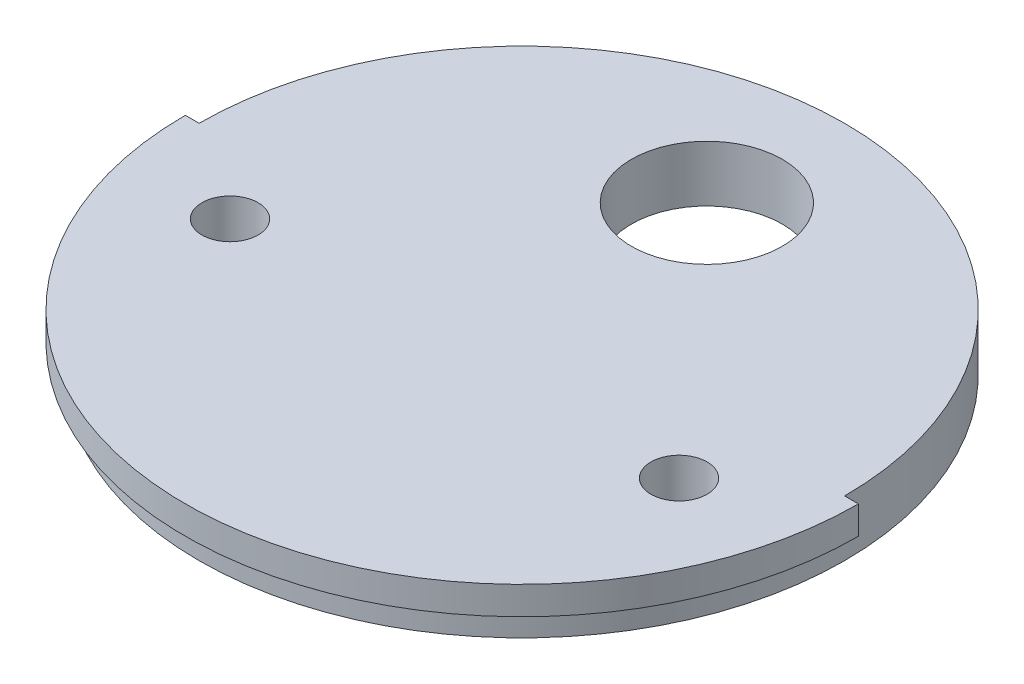
ISO-10303-21;
HEADER;
FILE_DESCRIPTION(('STEP AP214'),'2;1');
FILE_NAME('part.step','',(''),(''),'','','');
FILE_SCHEMA(('AUTOMOTIVE_DESIGN { 1 0 10303 214 1 1 1 1 }'));
ENDSEC;
DATA;
#1=APPLICATION_CONTEXT('core data for automotive mechanical design processes');
#2=APPLICATION_PROTOCOL_DEFINITION('international standard','automotive_design',2000,#1);
#3=PRODUCT_CONTEXT('',#1,'mechanical');
#4=PRODUCT('Part','Part','',(#3));
#5=PRODUCT_RELATED_PRODUCT_CATEGORY('part','',(#4));
#6=PRODUCT_DEFINITION_FORMATION('','',#4);
#7=PRODUCT_DEFINITION_CONTEXT('part definition',#1,'design');
#8=PRODUCT_DEFINITION('design','',#6,#7);
#9=PRODUCT_DEFINITION_SHAPE('','',#8);
#10=(LENGTH_UNIT() NAMED_UNIT(*) SI_UNIT(.MILLI.,.METRE.));
#11=(NAMED_UNIT(*) PLANE_ANGLE_UNIT() SI_UNIT($,.RADIAN.));
#12=(NAMED_UNIT(*) SI_UNIT($,.STERADIAN.) SOLID_ANGLE_UNIT());
#13=UNCERTAINTY_MEASURE_WITH_UNIT(LENGTH_MEASURE(1.E-05),#10,'distance_accuracy_value','');
#14=(GEOMETRIC_REPRESENTATION_CONTEXT(3) GLOBAL_UNCERTAINTY_ASSIGNED_CONTEXT((#13)) GLOBAL_UNIT_ASSIGNED_CONTEXT((#10,
#11,#12)) REPRESENTATION_CONTEXT('',''));
#15=CARTESIAN_POINT('',(0.,0.,0.));
#16=DIRECTION('',(0.,0.,1.));
#17=DIRECTION('',(1.,0.,0.));
#18=AXIS2_PLACEMENT_3D('',#15,#16,#17);
#19=CARTESIAN_POINT('',(0.,3.175,0.));
#20=DIRECTION('',(0.,-1.,0.));
#21=DIRECTION('',(0.,0.,-1.));
#22=AXIS2_PLACEMENT_3D('',#19,#20,#21);
#23=CYLINDRICAL_SURFACE('',#22,36.5125);
#24=CARTESIAN_POINT('',(0.,0.,0.));
#25=DIRECTION('',(0.,1.,0.));
#26=DIRECTION('',(0.,0.,1.));
#27=AXIS2_PLACEMENT_3D('',#24,#25,#26);
#28=CIRCLE('',#27,36.5125);
#29=CARTESIAN_POINT('',(0.,0.,36.5125));
#30=VERTEX_POINT('',#29);
#31=EDGE_CURVE('E94',#30,#30,#28,.T.);
#32=ORIENTED_EDGE('',*,*,#31,.T.);
#33=EDGE_LOOP('',(#32));
#34=FACE_BOUND('',#33,.T.);
#35=CARTESIAN_POINT('',(0.,3.175,0.));
#36=DIRECTION('',(0.,1.,0.));
#37=DIRECTION('',(0.,0.,1.));
#38=AXIS2_PLACEMENT_3D('',#35,#36,#37);
#39=CIRCLE('',#38,36.5125);
#40=CARTESIAN_POINT('',(-36.5125,3.175,0.));
#41=VERTEX_POINT('',#40);
#42=CARTESIAN_POINT('',(36.5125,3.175,0.));
#43=VERTEX_POINT('',#42);
#44=EDGE_CURVE('E97',#41,#43,#39,.T.);
#45=ORIENTED_EDGE('',*,*,#44,.F.);
#46=DIRECTION('',(0.,-1.,0.));
#47=VECTOR('',#46,1.);
#48=CARTESIAN_POINT('',(-36.5125,6.35,0.));
#49=LINE('',#48,#47);
#50=CARTESIAN_POINT('',(-36.5125,6.35,0.));
#51=VERTEX_POINT('',#50);
#52=EDGE_CURVE('E110',#51,#41,#49,.T.);
#53=ORIENTED_EDGE('',*,*,#52,.F.);
#54=CARTESIAN_POINT('',(0.,6.35,0.));
#55=DIRECTION('',(0.,1.,0.));
#56=DIRECTION('',(0.,0.,-1.));
#57=AXIS2_PLACEMENT_3D('',#54,#55,#56);
#58=CIRCLE('',#57,36.5125);
#59=CARTESIAN_POINT('',(36.5125,6.35,0.));
#60=VERTEX_POINT('',#59);
#61=EDGE_CURVE('E78',#60,#51,#58,.T.);
#62=ORIENTED_EDGE('',*,*,#61,.F.);
#63=DIRECTION('',(0.,-1.,0.));
#64=VECTOR('',#63,1.);
#65=CARTESIAN_POINT('',(36.5125,6.35,0.));
#66=LINE('',#65,#64);
#67=EDGE_CURVE('E73',#60,#43,#66,.T.);
#68=ORIENTED_EDGE('',*,*,#67,.T.);
#69=EDGE_LOOP('',(#45,#53,#62,#68));
#70=FACE_BOUND('',#69,.T.);
#71=ADVANCED_FACE('F34',(#34,#70),#23,.T.);
#72=CARTESIAN_POINT('',(0.,0.,0.));
#73=DIRECTION('',(0.,1.,0.));
#74=DIRECTION('',(0.,0.,1.));
#75=AXIS2_PLACEMENT_3D('',#72,#73,#74);
#76=PLANE('',#75);
#77=CARTESIAN_POINT('',(-25.4,0.,7.62));
#78=DIRECTION('',(0.,-1.,0.));
#79=DIRECTION('',(0.,0.,-1.));
#80=AXIS2_PLACEMENT_3D('',#77,#78,#79);
#81=CIRCLE('',#80,3.175);
#82=CARTESIAN_POINT('',(-25.4,0.,4.445));
#83=VERTEX_POINT('',#82);
#84=EDGE_CURVE('E129',#83,#83,#81,.T.);
#85=ORIENTED_EDGE('',*,*,#84,.F.);
#86=EDGE_LOOP('',(#85));
#87=FACE_BOUND('',#86,.T.);
#88=CARTESIAN_POINT('',(25.4,0.,7.62));
#89=DIRECTION('',(0.,-1.,0.));
#90=DIRECTION('',(0.,0.,-1.));
#91=AXIS2_PLACEMENT_3D('',#88,#89,#90);
#92=CIRCLE('',#91,3.175);
#93=CARTESIAN_POINT('',(25.4,0.,4.44499999999999));
#94=VERTEX_POINT('',#93);
#95=EDGE_CURVE('E123',#94,#94,#92,.T.);
#96=ORIENTED_EDGE('',*,*,#95,.F.);
#97=EDGE_LOOP('',(#96));
#98=FACE_BOUND('',#97,.T.);
#99=CARTESIAN_POINT('',(0.,0.,-20.9296));
#100=DIRECTION('',(0.,-1.,0.));
#101=DIRECTION('',(0.,0.,-1.));
#102=AXIS2_PLACEMENT_3D('',#99,#100,#101);
#103=CIRCLE('',#102,8.5344);
#104=CARTESIAN_POINT('',(0.,0.,-29.464));
#105=VERTEX_POINT('',#104);
#106=EDGE_CURVE('E102',#105,#105,#103,.T.);
#107=ORIENTED_EDGE('',*,*,#106,.F.);
#108=EDGE_LOOP('',(#107));
#109=FACE_BOUND('',#108,.T.);
#110=ORIENTED_EDGE('',*,*,#31,.F.);
#111=EDGE_LOOP('',(#110));
#112=FACE_BOUND('',#111,.T.);
#113=ADVANCED_FACE('F144',(#87,#98,#109,#112),#76,.F.);
#114=CARTESIAN_POINT('',(0.,6.35,0.));
#115=DIRECTION('',(0.,-1.,0.));
#116=DIRECTION('',(0.,0.,-1.));
#117=AXIS2_PLACEMENT_3D('',#114,#115,#116);
#118=CYLINDRICAL_SURFACE('',#117,38.0746);
#119=CARTESIAN_POINT('',(0.,6.35,0.));
#120=DIRECTION('',(0.,1.,0.));
#121=DIRECTION('',(0.,0.,1.));
#122=AXIS2_PLACEMENT_3D('',#119,#120,#121);
#123=CIRCLE('',#122,38.0746);
#124=CARTESIAN_POINT('',(-38.0746,6.35,0.));
#125=VERTEX_POINT('',#124);
#126=CARTESIAN_POINT('',(38.0746,6.35,0.));
#127=VERTEX_POINT('',#126);
#128=EDGE_CURVE('E85',#125,#127,#123,.T.);
#129=ORIENTED_EDGE('',*,*,#128,.F.);
#130=DIRECTION('',(0.,-1.,0.));
#131=VECTOR('',#130,1.);
#132=CARTESIAN_POINT('',(-38.0746,6.35,0.));
#133=LINE('',#132,#131);
#134=CARTESIAN_POINT('',(-38.0746,3.175,0.));
#135=VERTEX_POINT('',#134);
#136=EDGE_CURVE('E112',#125,#135,#133,.T.);
#137=ORIENTED_EDGE('',*,*,#136,.T.);
#138=CARTESIAN_POINT('',(0.,3.175,0.));
#139=DIRECTION('',(0.,1.,0.));
#140=DIRECTION('',(0.,0.,1.));
#141=AXIS2_PLACEMENT_3D('',#138,#139,#140);
#142=CIRCLE('',#141,38.0746);
#143=CARTESIAN_POINT('',(38.0746,3.175,0.));
#144=VERTEX_POINT('',#143);
#145=EDGE_CURVE('E87',#135,#144,#142,.T.);
#146=ORIENTED_EDGE('',*,*,#145,.T.);
#147=DIRECTION('',(0.,-1.,0.));
#148=VECTOR('',#147,1.);
#149=CARTESIAN_POINT('',(38.0746,6.35,0.));
#150=LINE('',#149,#148);
#151=EDGE_CURVE('E48',#127,#144,#150,.T.);
#152=ORIENTED_EDGE('',*,*,#151,.F.);
#153=EDGE_LOOP('',(#129,#137,#146,#152));
#154=FACE_BOUND('',#153,.T.);
#155=ADVANCED_FACE('F84',(#154),#118,.T.);
#156=CARTESIAN_POINT('',(0.,6.35,0.));
#157=DIRECTION('',(0.,1.,0.));
#158=DIRECTION('',(0.,0.,1.));
#159=AXIS2_PLACEMENT_3D('',#156,#157,#158);
#160=PLANE('',#159);
#161=CARTESIAN_POINT('',(-25.4,6.35,7.62));
#162=DIRECTION('',(0.,-1.,0.));
#163=DIRECTION('',(0.,0.,-1.));
#164=AXIS2_PLACEMENT_3D('',#161,#162,#163);
#165=CIRCLE('',#164,3.175);
#166=CARTESIAN_POINT('',(-25.4,6.35,4.445));
#167=VERTEX_POINT('',#166);
#168=EDGE_CURVE('E79',#167,#167,#165,.T.);
#169=ORIENTED_EDGE('',*,*,#168,.T.);
#170=EDGE_LOOP('',(#169));
#171=FACE_BOUND('',#170,.T.);
#172=CARTESIAN_POINT('',(25.4,6.35,7.62));
#173=DIRECTION('',(0.,-1.,0.));
#174=DIRECTION('',(0.,0.,-1.));
#175=AXIS2_PLACEMENT_3D('',#172,#173,#174);
#176=CIRCLE('',#175,3.175);
#177=CARTESIAN_POINT('',(25.4,6.35,4.44499999999999));
#178=VERTEX_POINT('',#177);
#179=EDGE_CURVE('E126',#178,#178,#176,.T.);
#180=ORIENTED_EDGE('',*,*,#179,.T.);
#181=EDGE_LOOP('',(#180));
#182=FACE_BOUND('',#181,.T.);
#183=DIRECTION('',(-1.,0.,0.));
#184=VECTOR('',#183,1.);
#185=CARTESIAN_POINT('',(-38.0746,6.35,0.));
#186=LINE('',#185,#184);
#187=EDGE_CURVE('E88',#51,#125,#186,.T.);
#188=ORIENTED_EDGE('',*,*,#187,.T.);
#189=ORIENTED_EDGE('',*,*,#128,.T.);
#190=DIRECTION('',(-1.,0.,0.));
#191=VECTOR('',#190,1.);
#192=CARTESIAN_POINT('',(38.0746,6.35,0.));
#193=LINE('',#192,#191);
#194=EDGE_CURVE('E70',#127,#60,#193,.T.);
#195=ORIENTED_EDGE('',*,*,#194,.T.);
#196=ORIENTED_EDGE('',*,*,#61,.T.);
#197=EDGE_LOOP('',(#188,#189,#195,#196));
#198=FACE_BOUND('',#197,.T.);
#199=CARTESIAN_POINT('',(0.,6.35,-20.9296));
#200=DIRECTION('',(0.,-1.,0.));
#201=DIRECTION('',(0.,0.,-1.));
#202=AXIS2_PLACEMENT_3D('',#199,#200,#201);
#203=CIRCLE('',#202,8.5344);
#204=CARTESIAN_POINT('',(0.,6.35,-29.464));
#205=VERTEX_POINT('',#204);
#206=EDGE_CURVE('E99',#205,#205,#203,.T.);
#207=ORIENTED_EDGE('',*,*,#206,.T.);
#208=EDGE_LOOP('',(#207));
#209=FACE_BOUND('',#208,.T.);
#210=ADVANCED_FACE('F91',(#171,#182,#198,#209),#160,.T.);
#211=CARTESIAN_POINT('',(0.,3.175,0.));
#212=DIRECTION('',(0.,1.,0.));
#213=DIRECTION('',(0.,0.,1.));
#214=AXIS2_PLACEMENT_3D('',#211,#212,#213);
#215=PLANE('',#214);
#216=ORIENTED_EDGE('',*,*,#145,.F.);
#217=DIRECTION('',(1.,0.,0.));
#218=VECTOR('',#217,1.);
#219=CARTESIAN_POINT('',(0.,3.175,0.));
#220=LINE('',#219,#218);
#221=EDGE_CURVE('E11',#135,#41,#220,.T.);
#222=ORIENTED_EDGE('',*,*,#221,.T.);
#223=ORIENTED_EDGE('',*,*,#44,.T.);
#224=DIRECTION('',(1.,0.,0.));
#225=VECTOR('',#224,1.);
#226=CARTESIAN_POINT('',(0.,3.175,0.));
#227=LINE('',#226,#225);
#228=EDGE_CURVE('E41',#43,#144,#227,.T.);
#229=ORIENTED_EDGE('',*,*,#228,.T.);
#230=EDGE_LOOP('',(#216,#222,#223,#229));
#231=FACE_BOUND('',#230,.T.);
#232=ADVANCED_FACE('F107',(#231),#215,.F.);
#233=CARTESIAN_POINT('',(-38.0746,6.35,0.));
#234=DIRECTION('',(0.,0.,1.));
#235=DIRECTION('',(1.,0.,0.));
#236=AXIS2_PLACEMENT_3D('',#233,#234,#235);
#237=PLANE('',#236);
#238=ORIENTED_EDGE('',*,*,#136,.F.);
#239=ORIENTED_EDGE('',*,*,#187,.F.);
#240=ORIENTED_EDGE('',*,*,#52,.T.);
#241=ORIENTED_EDGE('',*,*,#221,.F.);
#242=EDGE_LOOP('',(#238,#239,#240,#241));
#243=FACE_BOUND('',#242,.T.);
#244=ADVANCED_FACE('F179',(#243),#237,.F.);
#245=CARTESIAN_POINT('',(38.0746,6.35,0.));
#246=DIRECTION('',(0.,0.,1.));
#247=DIRECTION('',(1.,0.,0.));
#248=AXIS2_PLACEMENT_3D('',#245,#246,#247);
#249=PLANE('',#248);
#250=ORIENTED_EDGE('',*,*,#67,.F.);
#251=ORIENTED_EDGE('',*,*,#194,.F.);
#252=ORIENTED_EDGE('',*,*,#151,.T.);
#253=ORIENTED_EDGE('',*,*,#228,.F.);
#254=EDGE_LOOP('',(#250,#251,#252,#253));
#255=FACE_BOUND('',#254,.T.);
#256=ADVANCED_FACE('F71',(#255),#249,.F.);
#257=CARTESIAN_POINT('',(0.,6.35,-20.9296));
#258=DIRECTION('',(0.,-1.,0.));
#259=DIRECTION('',(0.,0.,-1.));
#260=AXIS2_PLACEMENT_3D('',#257,#258,#259);
#261=CYLINDRICAL_SURFACE('',#260,8.5344);
#262=ORIENTED_EDGE('',*,*,#206,.F.);
#263=EDGE_LOOP('',(#262));
#264=FACE_BOUND('',#263,.T.);
#265=ORIENTED_EDGE('',*,*,#106,.T.);
#266=EDGE_LOOP('',(#265));
#267=FACE_BOUND('',#266,.T.);
#268=ADVANCED_FACE('F192',(#264,#267),#261,.F.);
#269=CARTESIAN_POINT('',(25.4,6.35,7.62));
#270=DIRECTION('',(0.,-1.,0.));
#271=DIRECTION('',(0.,0.,-1.));
#272=AXIS2_PLACEMENT_3D('',#269,#270,#271);
#273=CYLINDRICAL_SURFACE('',#272,3.175);
#274=ORIENTED_EDGE('',*,*,#179,.F.);
#275=EDGE_LOOP('',(#274));
#276=FACE_BOUND('',#275,.T.);
#277=ORIENTED_EDGE('',*,*,#95,.T.);
#278=EDGE_LOOP('',(#277));
#279=FACE_BOUND('',#278,.T.);
#280=ADVANCED_FACE('F140',(#276,#279),#273,.F.);
#281=CARTESIAN_POINT('',(-25.4,6.35,7.62));
#282=DIRECTION('',(0.,-1.,0.));
#283=DIRECTION('',(0.,0.,-1.));
#284=AXIS2_PLACEMENT_3D('',#281,#282,#283);
#285=CYLINDRICAL_SURFACE('',#284,3.175);
#286=ORIENTED_EDGE('',*,*,#168,.F.);
#287=EDGE_LOOP('',(#286));
#288=FACE_BOUND('',#287,.T.);
#289=ORIENTED_EDGE('',*,*,#84,.T.);
#290=EDGE_LOOP('',(#289));
#291=FACE_BOUND('',#290,.T.);
#292=ADVANCED_FACE('F137',(#288,#291),#285,.F.);
#293=CLOSED_SHELL('',(#71,#113,#155,#210,#232,#244,#256,#268,#280,#292));
#294=MANIFOLD_SOLID_BREP('B2',#293);
#295=ADVANCED_BREP_SHAPE_REPRESENTATION('',(#18,#294),#14);
#296=SHAPE_DEFINITION_REPRESENTATION(#9,#295);
ENDSEC;
END-ISO-10303-21;
